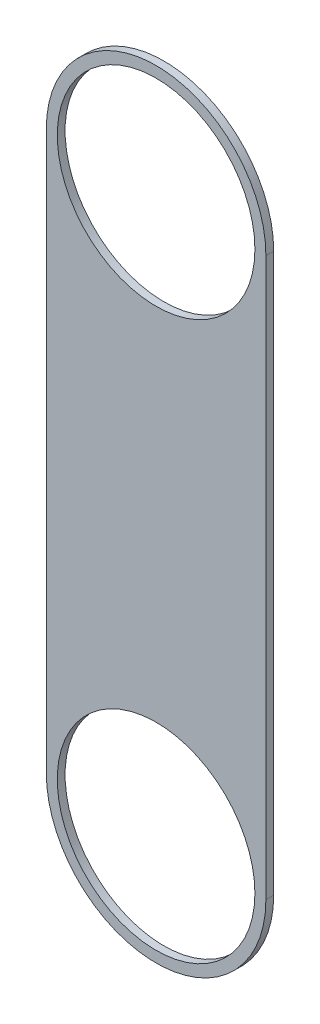
ISO-10303-21;
HEADER;
FILE_DESCRIPTION(('STEP AP214'),'2;1');
FILE_NAME('part.step','',(''),(''),'','','');
FILE_SCHEMA(('AUTOMOTIVE_DESIGN { 1 0 10303 214 1 1 1 1 }'));
ENDSEC;
DATA;
#1=APPLICATION_CONTEXT('core data for automotive mechanical design processes');
#2=APPLICATION_PROTOCOL_DEFINITION('international standard','automotive_design',2000,#1);
#3=PRODUCT_CONTEXT('',#1,'mechanical');
#4=PRODUCT('Part','Part','',(#3));
#5=PRODUCT_RELATED_PRODUCT_CATEGORY('part','',(#4));
#6=PRODUCT_DEFINITION_FORMATION('','',#4);
#7=PRODUCT_DEFINITION_CONTEXT('part definition',#1,'design');
#8=PRODUCT_DEFINITION('design','',#6,#7);
#9=PRODUCT_DEFINITION_SHAPE('','',#8);
#10=(LENGTH_UNIT() NAMED_UNIT(*) SI_UNIT(.MILLI.,.METRE.));
#11=(NAMED_UNIT(*) PLANE_ANGLE_UNIT() SI_UNIT($,.RADIAN.));
#12=(NAMED_UNIT(*) SI_UNIT($,.STERADIAN.) SOLID_ANGLE_UNIT());
#13=UNCERTAINTY_MEASURE_WITH_UNIT(LENGTH_MEASURE(1.E-05),#10,'distance_accuracy_value','');
#14=(GEOMETRIC_REPRESENTATION_CONTEXT(3) GLOBAL_UNCERTAINTY_ASSIGNED_CONTEXT((#13)) GLOBAL_UNIT_ASSIGNED_CONTEXT((#10,
#11,#12)) REPRESENTATION_CONTEXT('',''));
#15=CARTESIAN_POINT('',(0.,0.,0.));
#16=DIRECTION('',(0.,0.,1.));
#17=DIRECTION('',(1.,0.,0.));
#18=AXIS2_PLACEMENT_3D('',#15,#16,#17);
#19=CARTESIAN_POINT('',(69.3999882,41.0399992,0.));
#20=DIRECTION('',(-1.,0.,0.));
#21=DIRECTION('',(0.,1.,0.));
#22=AXIS2_PLACEMENT_3D('',#19,#20,#21);
#23=PLANE('',#22);
#24=DIRECTION('',(0.,1.,0.));
#25=VECTOR('',#24,1.);
#26=CARTESIAN_POINT('',(69.3999882,41.0399992,0.03556));
#27=LINE('',#26,#25);
#28=CARTESIAN_POINT('',(69.3999882,41.0399992,0.03556));
#29=VERTEX_POINT('',#28);
#30=CARTESIAN_POINT('',(69.3999882,43.5799992,0.03556));
#31=VERTEX_POINT('',#30);
#32=EDGE_CURVE('E11',#29,#31,#27,.T.);
#33=ORIENTED_EDGE('',*,*,#32,.F.);
#34=DIRECTION('',(0.,0.,1.));
#35=VECTOR('',#34,1.);
#36=CARTESIAN_POINT('',(69.3999882,41.0399992,0.));
#37=LINE('',#36,#35);
#38=CARTESIAN_POINT('',(69.3999882,41.0399992,0.));
#39=VERTEX_POINT('',#38);
#40=EDGE_CURVE('E24',#39,#29,#37,.T.);
#41=ORIENTED_EDGE('',*,*,#40,.F.);
#42=DIRECTION('',(0.,1.,0.));
#43=VECTOR('',#42,1.);
#44=CARTESIAN_POINT('',(69.3999882,41.0399992,0.));
#45=LINE('',#44,#43);
#46=CARTESIAN_POINT('',(69.3999882,43.5799992,0.));
#47=VERTEX_POINT('',#46);
#48=EDGE_CURVE('E110',#39,#47,#45,.T.);
#49=ORIENTED_EDGE('',*,*,#48,.T.);
#50=DIRECTION('',(0.,0.,1.));
#51=VECTOR('',#50,1.);
#52=CARTESIAN_POINT('',(69.3999882,43.5799992,0.));
#53=LINE('',#52,#51);
#54=EDGE_CURVE('E37',#47,#31,#53,.T.);
#55=ORIENTED_EDGE('',*,*,#54,.T.);
#56=EDGE_LOOP('',(#33,#41,#49,#55));
#57=FACE_BOUND('',#56,.T.);
#58=ADVANCED_FACE('F17',(#57),#23,.F.);
#59=CARTESIAN_POINT('',(68.8999892,41.0399992,0.));
#60=DIRECTION('',(0.,0.,-1.));
#61=DIRECTION('',(-1.,0.,0.));
#62=AXIS2_PLACEMENT_3D('',#59,#60,#61);
#63=CYLINDRICAL_SURFACE('',#62,0.499998999999998);
#64=CARTESIAN_POINT('',(68.8999892,41.0399992,0.03556));
#65=DIRECTION('',(0.,0.,1.));
#66=DIRECTION('',(-1.,0.,0.));
#67=AXIS2_PLACEMENT_3D('',#64,#65,#66);
#68=CIRCLE('',#67,0.499998999999998);
#69=CARTESIAN_POINT('',(68.3999902,41.0399992,0.03556));
#70=VERTEX_POINT('',#69);
#71=EDGE_CURVE('E106',#70,#29,#68,.T.);
#72=ORIENTED_EDGE('',*,*,#71,.F.);
#73=DIRECTION('',(0.,0.,1.));
#74=VECTOR('',#73,1.);
#75=CARTESIAN_POINT('',(68.3999902,41.0399992,0.));
#76=LINE('',#75,#74);
#77=CARTESIAN_POINT('',(68.3999902,41.0399992,0.));
#78=VERTEX_POINT('',#77);
#79=EDGE_CURVE('E104',#78,#70,#76,.T.);
#80=ORIENTED_EDGE('',*,*,#79,.F.);
#81=CARTESIAN_POINT('',(68.8999892,41.0399992,0.));
#82=DIRECTION('',(0.,0.,1.));
#83=DIRECTION('',(-1.,0.,0.));
#84=AXIS2_PLACEMENT_3D('',#81,#82,#83);
#85=CIRCLE('',#84,0.499998999999998);
#86=EDGE_CURVE('E102',#78,#39,#85,.T.);
#87=ORIENTED_EDGE('',*,*,#86,.T.);
#88=ORIENTED_EDGE('',*,*,#40,.T.);
#89=EDGE_LOOP('',(#72,#80,#87,#88));
#90=FACE_BOUND('',#89,.T.);
#91=ADVANCED_FACE('F126',(#90),#63,.T.);
#92=CARTESIAN_POINT('',(68.8999892,43.5799992,0.));
#93=DIRECTION('',(0.,0.,-1.));
#94=DIRECTION('',(1.,0.,0.));
#95=AXIS2_PLACEMENT_3D('',#92,#93,#94);
#96=CYLINDRICAL_SURFACE('',#95,0.499998999999995);
#97=CARTESIAN_POINT('',(68.8999892,43.5799992,0.03556));
#98=DIRECTION('',(0.,0.,1.));
#99=DIRECTION('',(1.,0.,0.));
#100=AXIS2_PLACEMENT_3D('',#97,#98,#99);
#101=CIRCLE('',#100,0.499998999999995);
#102=CARTESIAN_POINT('',(68.3999902,43.5799992,0.03556));
#103=VERTEX_POINT('',#102);
#104=EDGE_CURVE('E99',#31,#103,#101,.T.);
#105=ORIENTED_EDGE('',*,*,#104,.F.);
#106=ORIENTED_EDGE('',*,*,#54,.F.);
#107=CARTESIAN_POINT('',(68.8999892,43.5799992,0.));
#108=DIRECTION('',(0.,0.,1.));
#109=DIRECTION('',(1.,0.,0.));
#110=AXIS2_PLACEMENT_3D('',#107,#108,#109);
#111=CIRCLE('',#110,0.499998999999995);
#112=CARTESIAN_POINT('',(68.3999902,43.5799992,0.));
#113=VERTEX_POINT('',#112);
#114=EDGE_CURVE('E96',#47,#113,#111,.T.);
#115=ORIENTED_EDGE('',*,*,#114,.T.);
#116=DIRECTION('',(0.,0.,1.));
#117=VECTOR('',#116,1.);
#118=CARTESIAN_POINT('',(68.3999902,43.5799992,0.));
#119=LINE('',#118,#117);
#120=EDGE_CURVE('E94',#113,#103,#119,.T.);
#121=ORIENTED_EDGE('',*,*,#120,.T.);
#122=EDGE_LOOP('',(#105,#106,#115,#121));
#123=FACE_BOUND('',#122,.T.);
#124=ADVANCED_FACE('F119',(#123),#96,.T.);
#125=CARTESIAN_POINT('',(68.3999902,43.5799992,0.));
#126=DIRECTION('',(1.,0.,0.));
#127=DIRECTION('',(0.,-1.,0.));
#128=AXIS2_PLACEMENT_3D('',#125,#126,#127);
#129=PLANE('',#128);
#130=DIRECTION('',(0.,-1.,0.));
#131=VECTOR('',#130,1.);
#132=CARTESIAN_POINT('',(68.3999902,43.5799992,0.03556));
#133=LINE('',#132,#131);
#134=EDGE_CURVE('E91',#103,#70,#133,.T.);
#135=ORIENTED_EDGE('',*,*,#134,.F.);
#136=ORIENTED_EDGE('',*,*,#120,.F.);
#137=DIRECTION('',(0.,-1.,0.));
#138=VECTOR('',#137,1.);
#139=CARTESIAN_POINT('',(68.3999902,43.5799992,0.));
#140=LINE('',#139,#138);
#141=EDGE_CURVE('E88',#113,#78,#140,.T.);
#142=ORIENTED_EDGE('',*,*,#141,.T.);
#143=ORIENTED_EDGE('',*,*,#79,.T.);
#144=EDGE_LOOP('',(#135,#136,#142,#143));
#145=FACE_BOUND('',#144,.T.);
#146=ADVANCED_FACE('F125',(#145),#129,.F.);
#147=CARTESIAN_POINT('',(68.8999892,41.0399992,0.));
#148=DIRECTION('',(0.,0.,-1.));
#149=DIRECTION('',(1.,0.,0.));
#150=AXIS2_PLACEMENT_3D('',#147,#148,#149);
#151=CYLINDRICAL_SURFACE('',#150,0.4499991);
#152=DIRECTION('',(0.,0.,1.));
#153=VECTOR('',#152,1.);
#154=CARTESIAN_POINT('',(69.3499883,41.0399992,0.));
#155=LINE('',#154,#153);
#156=CARTESIAN_POINT('',(69.3499883,41.0399992,0.));
#157=VERTEX_POINT('',#156);
#158=CARTESIAN_POINT('',(69.3499883,41.0399992,0.03556));
#159=VERTEX_POINT('',#158);
#160=EDGE_CURVE('E86',#157,#159,#155,.T.);
#161=ORIENTED_EDGE('',*,*,#160,.T.);
#162=CARTESIAN_POINT('',(68.8999892,41.0399992,0.03556));
#163=DIRECTION('',(0.,0.,1.));
#164=DIRECTION('',(1.,0.,0.));
#165=AXIS2_PLACEMENT_3D('',#162,#163,#164);
#166=CIRCLE('',#165,0.4499991);
#167=EDGE_CURVE('E83',#159,#159,#166,.T.);
#168=ORIENTED_EDGE('',*,*,#167,.T.);
#169=ORIENTED_EDGE('',*,*,#160,.F.);
#170=CARTESIAN_POINT('',(68.8999892,41.0399992,0.));
#171=DIRECTION('',(0.,0.,1.));
#172=DIRECTION('',(1.,0.,0.));
#173=AXIS2_PLACEMENT_3D('',#170,#171,#172);
#174=CIRCLE('',#173,0.4499991);
#175=EDGE_CURVE('E74',#157,#157,#174,.T.);
#176=ORIENTED_EDGE('',*,*,#175,.F.);
#177=EDGE_LOOP('',(#161,#168,#169,#176));
#178=FACE_BOUND('',#177,.T.);
#179=ADVANCED_FACE('F137',(#178),#151,.F.);
#180=CARTESIAN_POINT('',(68.8999892,43.5799992,0.));
#181=DIRECTION('',(0.,0.,-1.));
#182=DIRECTION('',(1.,0.,0.));
#183=AXIS2_PLACEMENT_3D('',#180,#181,#182);
#184=CYLINDRICAL_SURFACE('',#183,0.4499991);
#185=DIRECTION('',(0.,0.,1.));
#186=VECTOR('',#185,1.);
#187=CARTESIAN_POINT('',(69.3499883,43.5799992,0.));
#188=LINE('',#187,#186);
#189=CARTESIAN_POINT('',(69.3499883,43.5799992,0.));
#190=VERTEX_POINT('',#189);
#191=CARTESIAN_POINT('',(69.3499883,43.5799992,0.03556));
#192=VERTEX_POINT('',#191);
#193=EDGE_CURVE('E68',#190,#192,#188,.T.);
#194=ORIENTED_EDGE('',*,*,#193,.T.);
#195=CARTESIAN_POINT('',(68.8999892,43.5799992,0.03556));
#196=DIRECTION('',(0.,0.,1.));
#197=DIRECTION('',(1.,0.,0.));
#198=AXIS2_PLACEMENT_3D('',#195,#196,#197);
#199=CIRCLE('',#198,0.4499991);
#200=EDGE_CURVE('E73',#192,#192,#199,.T.);
#201=ORIENTED_EDGE('',*,*,#200,.T.);
#202=ORIENTED_EDGE('',*,*,#193,.F.);
#203=CARTESIAN_POINT('',(68.8999892,43.5799992,0.));
#204=DIRECTION('',(0.,0.,1.));
#205=DIRECTION('',(1.,0.,0.));
#206=AXIS2_PLACEMENT_3D('',#203,#204,#205);
#207=CIRCLE('',#206,0.4499991);
#208=EDGE_CURVE('E71',#190,#190,#207,.T.);
#209=ORIENTED_EDGE('',*,*,#208,.F.);
#210=EDGE_LOOP('',(#194,#201,#202,#209));
#211=FACE_BOUND('',#210,.T.);
#212=ADVANCED_FACE('F70',(#211),#184,.F.);
#213=CARTESIAN_POINT('',(69.3999882,41.0399992,0.));
#214=DIRECTION('',(0.,0.,-1.));
#215=DIRECTION('',(-1.,0.,0.));
#216=AXIS2_PLACEMENT_3D('',#213,#214,#215);
#217=PLANE('',#216);
#218=ORIENTED_EDGE('',*,*,#48,.F.);
#219=ORIENTED_EDGE('',*,*,#86,.F.);
#220=ORIENTED_EDGE('',*,*,#141,.F.);
#221=ORIENTED_EDGE('',*,*,#114,.F.);
#222=EDGE_LOOP('',(#218,#219,#220,#221));
#223=FACE_BOUND('',#222,.T.);
#224=ORIENTED_EDGE('',*,*,#175,.T.);
#225=EDGE_LOOP('',(#224));
#226=FACE_BOUND('',#225,.T.);
#227=ORIENTED_EDGE('',*,*,#208,.T.);
#228=EDGE_LOOP('',(#227));
#229=FACE_BOUND('',#228,.T.);
#230=ADVANCED_FACE('F77',(#223,#226,#229),#217,.T.);
#231=CARTESIAN_POINT('',(69.3999882,41.0399992,0.03556));
#232=DIRECTION('',(0.,0.,-1.));
#233=DIRECTION('',(-1.,0.,0.));
#234=AXIS2_PLACEMENT_3D('',#231,#232,#233);
#235=PLANE('',#234);
#236=ORIENTED_EDGE('',*,*,#134,.T.);
#237=ORIENTED_EDGE('',*,*,#71,.T.);
#238=ORIENTED_EDGE('',*,*,#32,.T.);
#239=ORIENTED_EDGE('',*,*,#104,.T.);
#240=EDGE_LOOP('',(#236,#237,#238,#239));
#241=FACE_BOUND('',#240,.T.);
#242=ORIENTED_EDGE('',*,*,#167,.F.);
#243=EDGE_LOOP('',(#242));
#244=FACE_BOUND('',#243,.T.);
#245=ORIENTED_EDGE('',*,*,#200,.F.);
#246=EDGE_LOOP('',(#245));
#247=FACE_BOUND('',#246,.T.);
#248=ADVANCED_FACE('F122',(#241,#244,#247),#235,.F.);
#249=CLOSED_SHELL('',(#58,#91,#124,#146,#179,#212,#230,#248));
#250=MANIFOLD_SOLID_BREP('B1',#249);
#251=ADVANCED_BREP_SHAPE_REPRESENTATION('',(#18,#250),#14);
#252=SHAPE_DEFINITION_REPRESENTATION(#9,#251);
ENDSEC;
END-ISO-10303-21;
